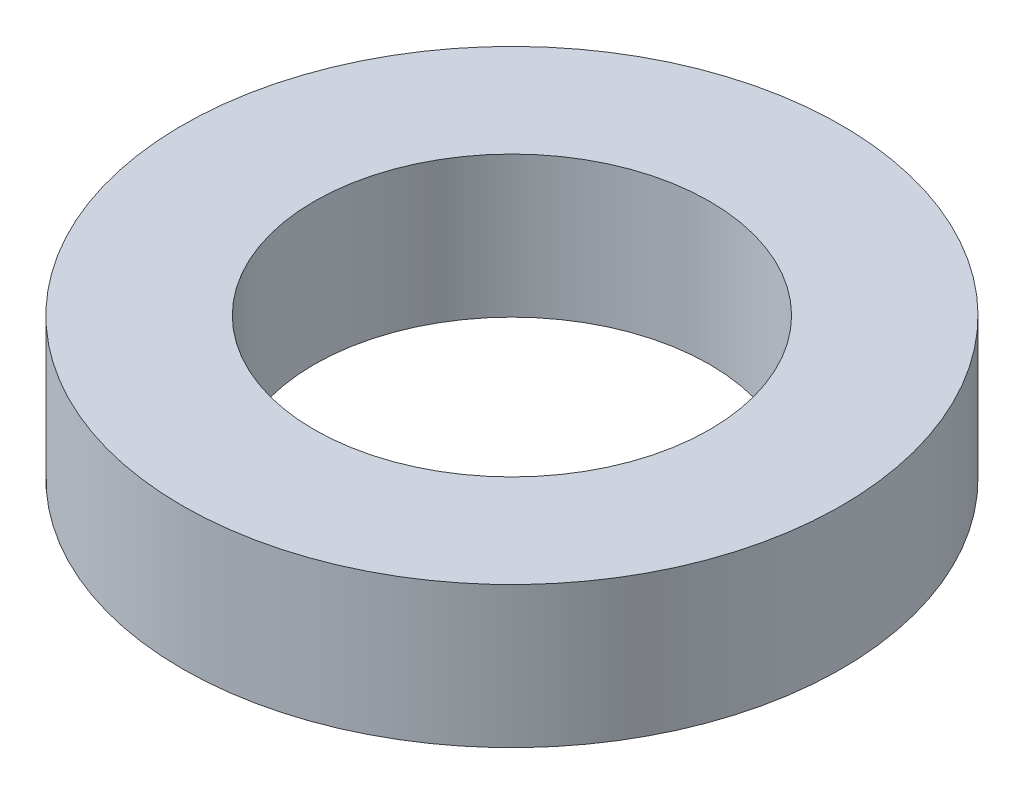
ISO-10303-21;
HEADER;
FILE_DESCRIPTION(('STEP AP214'),'2;1');
FILE_NAME('part.step','',(''),(''),'','','');
FILE_SCHEMA(('AUTOMOTIVE_DESIGN { 1 0 10303 214 1 1 1 1 }'));
ENDSEC;
DATA;
#1=APPLICATION_CONTEXT('core data for automotive mechanical design processes');
#2=APPLICATION_PROTOCOL_DEFINITION('international standard','automotive_design',2000,#1);
#3=PRODUCT_CONTEXT('',#1,'mechanical');
#4=PRODUCT('Part','Part','',(#3));
#5=PRODUCT_RELATED_PRODUCT_CATEGORY('part','',(#4));
#6=PRODUCT_DEFINITION_FORMATION('','',#4);
#7=PRODUCT_DEFINITION_CONTEXT('part definition',#1,'design');
#8=PRODUCT_DEFINITION('design','',#6,#7);
#9=PRODUCT_DEFINITION_SHAPE('','',#8);
#10=(LENGTH_UNIT() NAMED_UNIT(*) SI_UNIT(.MILLI.,.METRE.));
#11=(NAMED_UNIT(*) PLANE_ANGLE_UNIT() SI_UNIT($,.RADIAN.));
#12=(NAMED_UNIT(*) SI_UNIT($,.STERADIAN.) SOLID_ANGLE_UNIT());
#13=UNCERTAINTY_MEASURE_WITH_UNIT(LENGTH_MEASURE(1.E-05),#10,'distance_accuracy_value','');
#14=(GEOMETRIC_REPRESENTATION_CONTEXT(3) GLOBAL_UNCERTAINTY_ASSIGNED_CONTEXT((#13)) GLOBAL_UNIT_ASSIGNED_CONTEXT((#10,
#11,#12)) REPRESENTATION_CONTEXT('',''));
#15=CARTESIAN_POINT('',(0.,0.,0.));
#16=DIRECTION('',(0.,0.,1.));
#17=DIRECTION('',(1.,0.,0.));
#18=AXIS2_PLACEMENT_3D('',#15,#16,#17);
#19=CARTESIAN_POINT('',(0.,1.5,0.));
#20=DIRECTION('',(0.,-1.,0.));
#21=DIRECTION('',(0.,0.,-1.));
#22=AXIS2_PLACEMENT_3D('',#19,#20,#21);
#23=CYLINDRICAL_SURFACE('',#22,2.1);
#24=CARTESIAN_POINT('',(0.,1.5,0.));
#25=DIRECTION('',(0.,1.,0.));
#26=DIRECTION('',(0.,0.,1.));
#27=AXIS2_PLACEMENT_3D('',#24,#25,#26);
#28=CIRCLE('',#27,2.1);
#29=CARTESIAN_POINT('',(0.,1.5,2.1));
#30=VERTEX_POINT('',#29);
#31=EDGE_CURVE('E44',#30,#30,#28,.T.);
#32=ORIENTED_EDGE('',*,*,#31,.T.);
#33=EDGE_LOOP('',(#32));
#34=FACE_BOUND('',#33,.T.);
#35=CARTESIAN_POINT('',(0.,0.,0.));
#36=DIRECTION('',(0.,1.,0.));
#37=DIRECTION('',(0.,0.,1.));
#38=AXIS2_PLACEMENT_3D('',#35,#36,#37);
#39=CIRCLE('',#38,2.1);
#40=CARTESIAN_POINT('',(0.,0.,2.1));
#41=VERTEX_POINT('',#40);
#42=EDGE_CURVE('E50',#41,#41,#39,.T.);
#43=ORIENTED_EDGE('',*,*,#42,.F.);
#44=EDGE_LOOP('',(#43));
#45=FACE_BOUND('',#44,.T.);
#46=ADVANCED_FACE('F37',(#34,#45),#23,.F.);
#47=CARTESIAN_POINT('',(0.,1.5,0.));
#48=DIRECTION('',(0.,-1.,0.));
#49=DIRECTION('',(0.,0.,-1.));
#50=AXIS2_PLACEMENT_3D('',#47,#48,#49);
#51=CYLINDRICAL_SURFACE('',#50,3.5);
#52=CARTESIAN_POINT('',(0.,1.5,0.));
#53=DIRECTION('',(0.,1.,0.));
#54=DIRECTION('',(0.,0.,1.));
#55=AXIS2_PLACEMENT_3D('',#52,#53,#54);
#56=CIRCLE('',#55,3.5);
#57=CARTESIAN_POINT('',(0.,1.5,3.5));
#58=VERTEX_POINT('',#57);
#59=EDGE_CURVE('E10',#58,#58,#56,.T.);
#60=ORIENTED_EDGE('',*,*,#59,.F.);
#61=EDGE_LOOP('',(#60));
#62=FACE_BOUND('',#61,.T.);
#63=CARTESIAN_POINT('',(0.,0.,0.));
#64=DIRECTION('',(0.,1.,0.));
#65=DIRECTION('',(0.,0.,1.));
#66=AXIS2_PLACEMENT_3D('',#63,#64,#65);
#67=CIRCLE('',#66,3.5);
#68=CARTESIAN_POINT('',(0.,0.,3.5));
#69=VERTEX_POINT('',#68);
#70=EDGE_CURVE('E40',#69,#69,#67,.T.);
#71=ORIENTED_EDGE('',*,*,#70,.T.);
#72=EDGE_LOOP('',(#71));
#73=FACE_BOUND('',#72,.T.);
#74=ADVANCED_FACE('F57',(#62,#73),#51,.T.);
#75=CARTESIAN_POINT('',(0.,1.5,0.));
#76=DIRECTION('',(0.,1.,0.));
#77=DIRECTION('',(0.,0.,1.));
#78=AXIS2_PLACEMENT_3D('',#75,#76,#77);
#79=PLANE('',#78);
#80=ORIENTED_EDGE('',*,*,#31,.F.);
#81=EDGE_LOOP('',(#80));
#82=FACE_BOUND('',#81,.T.);
#83=ORIENTED_EDGE('',*,*,#59,.T.);
#84=EDGE_LOOP('',(#83));
#85=FACE_BOUND('',#84,.T.);
#86=ADVANCED_FACE('F61',(#82,#85),#79,.T.);
#87=CARTESIAN_POINT('',(0.,0.,0.));
#88=DIRECTION('',(0.,1.,0.));
#89=DIRECTION('',(0.,0.,1.));
#90=AXIS2_PLACEMENT_3D('',#87,#88,#89);
#91=PLANE('',#90);
#92=ORIENTED_EDGE('',*,*,#42,.T.);
#93=EDGE_LOOP('',(#92));
#94=FACE_BOUND('',#93,.T.);
#95=ORIENTED_EDGE('',*,*,#70,.F.);
#96=EDGE_LOOP('',(#95));
#97=FACE_BOUND('',#96,.T.);
#98=ADVANCED_FACE('F59',(#94,#97),#91,.F.);
#99=CLOSED_SHELL('',(#46,#74,#86,#98));
#100=MANIFOLD_SOLID_BREP('B2',#99);
#101=ADVANCED_BREP_SHAPE_REPRESENTATION('',(#18,#100),#14);
#102=SHAPE_DEFINITION_REPRESENTATION(#9,#101);
ENDSEC;
END-ISO-10303-21;
